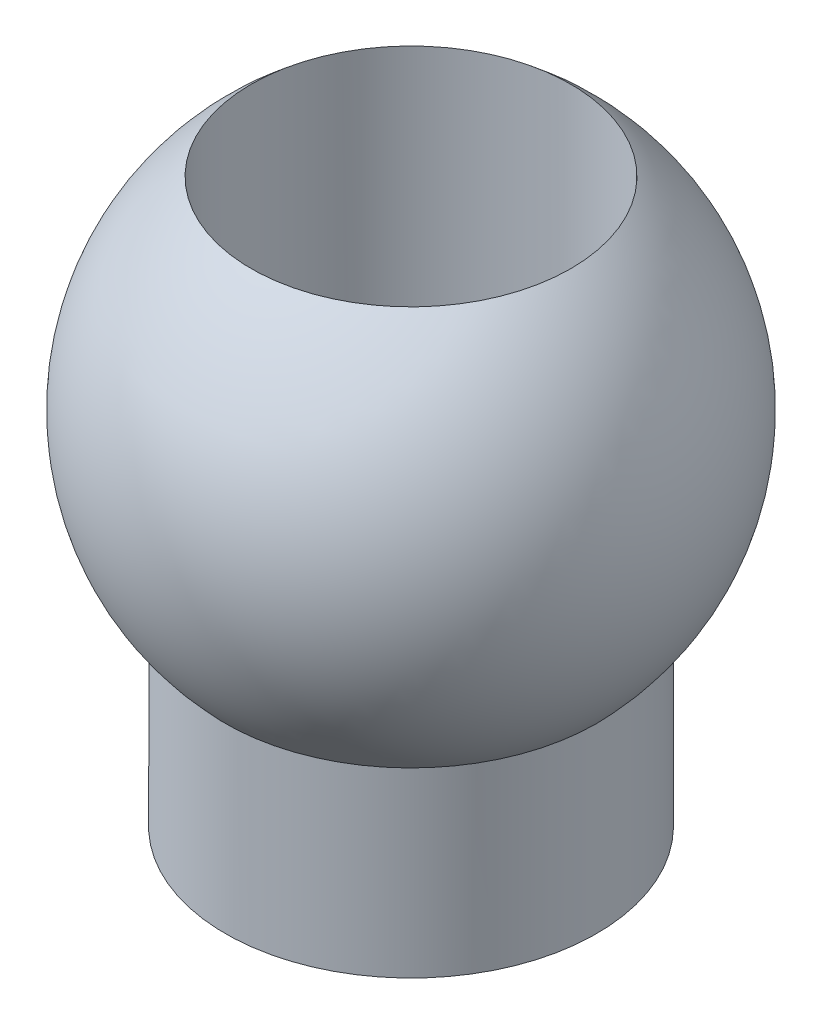
ISO-10303-21;
HEADER;
FILE_DESCRIPTION(('STEP AP214'),'2;1');
FILE_NAME('part.step','',(''),(''),'','','');
FILE_SCHEMA(('AUTOMOTIVE_DESIGN { 1 0 10303 214 1 1 1 1 }'));
ENDSEC;
DATA;
#1=APPLICATION_CONTEXT('core data for automotive mechanical design processes');
#2=APPLICATION_PROTOCOL_DEFINITION('international standard','automotive_design',2000,#1);
#3=PRODUCT_CONTEXT('',#1,'mechanical');
#4=PRODUCT('Part','Part','',(#3));
#5=PRODUCT_RELATED_PRODUCT_CATEGORY('part','',(#4));
#6=PRODUCT_DEFINITION_FORMATION('','',#4);
#7=PRODUCT_DEFINITION_CONTEXT('part definition',#1,'design');
#8=PRODUCT_DEFINITION('design','',#6,#7);
#9=PRODUCT_DEFINITION_SHAPE('','',#8);
#10=(LENGTH_UNIT() NAMED_UNIT(*) SI_UNIT(.MILLI.,.METRE.));
#11=(NAMED_UNIT(*) PLANE_ANGLE_UNIT() SI_UNIT($,.RADIAN.));
#12=(NAMED_UNIT(*) SI_UNIT($,.STERADIAN.) SOLID_ANGLE_UNIT());
#13=UNCERTAINTY_MEASURE_WITH_UNIT(LENGTH_MEASURE(1.E-05),#10,'distance_accuracy_value','');
#14=(GEOMETRIC_REPRESENTATION_CONTEXT(3) GLOBAL_UNCERTAINTY_ASSIGNED_CONTEXT((#13)) GLOBAL_UNIT_ASSIGNED_CONTEXT((#10,
#11,#12)) REPRESENTATION_CONTEXT('',''));
#15=CARTESIAN_POINT('',(0.,0.,0.));
#16=DIRECTION('',(0.,0.,1.));
#17=DIRECTION('',(1.,0.,0.));
#18=AXIS2_PLACEMENT_3D('',#15,#16,#17);
#19=CARTESIAN_POINT('',(0.,0.,0.));
#20=DIRECTION('',(0.,-1.,0.));
#21=DIRECTION('',(0.,0.,-1.));
#22=AXIS2_PLACEMENT_3D('',#19,#20,#21);
#23=PLANE('',#22);
#24=CARTESIAN_POINT('',(0.,0.,0.));
#25=DIRECTION('',(0.,-1.,0.));
#26=DIRECTION('',(0.,0.,-1.));
#27=AXIS2_PLACEMENT_3D('',#24,#25,#26);
#28=CIRCLE('',#27,1.55);
#29=CARTESIAN_POINT('',(0.,0.,-1.55));
#30=VERTEX_POINT('',#29);
#31=EDGE_CURVE('E48',#30,#30,#28,.T.);
#32=ORIENTED_EDGE('',*,*,#31,.F.);
#33=EDGE_LOOP('',(#32));
#34=FACE_BOUND('',#33,.T.);
#35=CARTESIAN_POINT('',(0.,0.,0.));
#36=DIRECTION('',(0.,-1.,0.));
#37=DIRECTION('',(0.,0.,-1.));
#38=AXIS2_PLACEMENT_3D('',#35,#36,#37);
#39=CIRCLE('',#38,1.8);
#40=CARTESIAN_POINT('',(0.,0.,-1.8));
#41=VERTEX_POINT('',#40);
#42=EDGE_CURVE('E44',#41,#41,#39,.T.);
#43=ORIENTED_EDGE('',*,*,#42,.T.);
#44=EDGE_LOOP('',(#43));
#45=FACE_BOUND('',#44,.T.);
#46=ADVANCED_FACE('F37',(#34,#45),#23,.T.);
#47=CARTESIAN_POINT('',(0.,3.5,0.));
#48=DIRECTION('',(0.,-1.,0.));
#49=DIRECTION('',(1.,0.,0.));
#50=AXIS2_PLACEMENT_3D('',#47,#48,#49);
#51=SPHERICAL_SURFACE('',#50,2.5);
#52=CARTESIAN_POINT('',(0.,5.4615045245933,0.));
#53=DIRECTION('',(0.,-1.,0.));
#54=DIRECTION('',(0.,0.,-1.));
#55=AXIS2_PLACEMENT_3D('',#52,#53,#54);
#56=CIRCLE('',#55,1.55);
#57=CARTESIAN_POINT('',(1.55,5.4615045245933,0.));
#58=VERTEX_POINT('',#57);
#59=EDGE_CURVE('E40',#58,#58,#56,.F.);
#60=CARTESIAN_POINT('',(0.,1.76506484271025,0.));
#61=DIRECTION('',(0.,-1.,0.));
#62=DIRECTION('',(0.,0.,-1.));
#63=AXIS2_PLACEMENT_3D('',#60,#61,#62);
#64=CIRCLE('',#63,1.8);
#65=CARTESIAN_POINT('',(1.8,1.76506484271025,0.));
#66=VERTEX_POINT('',#65);
#67=EDGE_CURVE('E10',#66,#66,#64,.T.);
#68=CARTESIAN_POINT('',(1.55,5.4615045245933,0.));
#69=CARTESIAN_POINT('',(1.58410327621643,5.43455719270086,0.));
#70=CARTESIAN_POINT('',(1.6175023493976,5.40671886245339,0.));
#71=CARTESIAN_POINT('',(1.68280445952651,5.34933957252458,0.));
#72=CARTESIAN_POINT('',(1.71470749647424,5.31979861284324,0.));
#73=CARTESIAN_POINT('',(1.77692990397332,5.25909343132291,0.));
#74=CARTESIAN_POINT('',(1.80724927452467,5.22792920948392,0.));
#75=CARTESIAN_POINT('',(1.86622211661338,5.16406252672216,0.));
#76=CARTESIAN_POINT('',(1.89487558815074,5.1313600657994,0.));
#77=CARTESIAN_POINT('',(1.95043863839102,5.06450577918777,0.));
#78=CARTESIAN_POINT('',(1.97734821709394,5.03035395349891,0.));
#79=CARTESIAN_POINT('',(2.0293503091851,4.96069384276134,0.));
#80=CARTESIAN_POINT('',(2.05444282257334,4.92518555771264,0.));
#81=CARTESIAN_POINT('',(2.1027425326583,4.85290909910658,0.));
#82=CARTESIAN_POINT('',(2.12594972935503,4.81614092554922,0.));
#83=CARTESIAN_POINT('',(2.17041568800909,4.74144469383435,0.));
#84=CARTESIAN_POINT('',(2.19167444996643,4.70351663567685,0.));
#85=CARTESIAN_POINT('',(2.23218571896611,4.6266037916256,0.));
#86=CARTESIAN_POINT('',(2.25143822600846,4.58761900573185,0.));
#87=CARTESIAN_POINT('',(2.28788462204426,4.50869873763307,0.));
#88=CARTESIAN_POINT('',(2.30507851103772,4.46876325542805,0.));
#89=CARTESIAN_POINT('',(2.33736090678991,4.38805021172483,0.));
#90=CARTESIAN_POINT('',(2.35244941354863,4.34727265022664,0.));
#91=CARTESIAN_POINT('',(2.38048000692047,4.26498635528641,0.));
#92=CARTESIAN_POINT('',(2.39342209353359,4.22347762184437,0.));
#93=CARTESIAN_POINT('',(2.41712464655699,4.13984187900786,0.));
#94=CARTESIAN_POINT('',(2.42788511296728,4.0977148696134,0.));
#95=CARTESIAN_POINT('',(2.44719515912892,4.01295715246084,0.));
#96=CARTESIAN_POINT('',(2.45574473888028,3.97032644470274,0.));
#97=CARTESIAN_POINT('',(2.47060975846568,3.88467727837642,0.));
#98=CARTESIAN_POINT('',(2.47692519829974,3.8416588198082,0.));
#99=CARTESIAN_POINT('',(2.48730476123514,3.75535115402502,0.));
#100=CARTESIAN_POINT('',(2.49136888433649,3.71206194681006,0.));
#101=CARTESIAN_POINT('',(2.49723476015158,3.62533052228244,0.));
#102=CARTESIAN_POINT('',(2.49903651286533,3.58188830496977,0.));
#103=CARTESIAN_POINT('',(2.50037274747474,3.49496901495461,0.));
#104=CARTESIAN_POINT('',(2.49990722937042,3.45149194225212,0.));
#105=CARTESIAN_POINT('',(2.49671018846586,3.36462119096538,0.));
#106=CARTESIAN_POINT('',(2.49397866566563,3.32122751238113,0.));
#107=CARTESIAN_POINT('',(2.48625704460065,3.23464157202239,0.));
#108=CARTESIAN_POINT('',(2.48126694633589,3.1914493102479,0.));
#109=CARTESIAN_POINT('',(2.46904174647556,3.10538367838467,0.));
#110=CARTESIAN_POINT('',(2.46180664487997,3.06251030829594,0.));
#111=CARTESIAN_POINT('',(2.4451111164833,2.97719906735241,0.));
#112=CARTESIAN_POINT('',(2.43565068968222,2.93476119649762,0.));
#113=CARTESIAN_POINT('',(2.41453024145945,2.85043637710139,0.));
#114=CARTESIAN_POINT('',(2.40287022003777,2.80854942855995,0.));
#115=CARTESIAN_POINT('',(2.37738229567794,2.72544037843538,0.));
#116=CARTESIAN_POINT('',(2.36355439273978,2.68421827685225,0.));
#117=CARTESIAN_POINT('',(2.33376831455976,2.60255103713723,0.));
#118=CARTESIAN_POINT('',(2.3178101393179,2.56210589900533,0.));
#119=CARTESIAN_POINT('',(2.28380692014723,2.4821025890897,0.));
#120=CARTESIAN_POINT('',(2.26576187621842,2.44254441730595,0.));
#121=CARTESIAN_POINT('',(2.22763399746029,2.36442263209638,0.));
#122=CARTESIAN_POINT('',(2.20755116263096,2.32585901867056,0.));
#123=CARTESIAN_POINT('',(2.16540232869856,2.24983123159263,0.));
#124=CARTESIAN_POINT('',(2.14333632959548,2.21236705794054,0.));
#125=CARTESIAN_POINT('',(2.0972811635807,2.1386400623846,0.));
#126=CARTESIAN_POINT('',(2.07329199666899,2.10237724048077,0.));
#127=CARTESIAN_POINT('',(2.02345581171938,2.03115151520767,0.));
#128=CARTESIAN_POINT('',(1.99760879368148,1.99618861183841,0.));
#129=CARTESIAN_POINT('',(1.94412694192524,1.92765804500053,0.));
#130=CARTESIAN_POINT('',(1.91649210820691,1.8940903815319,0.));
#131=CARTESIAN_POINT('',(1.85951077047679,1.82844073834545,0.));
#132=CARTESIAN_POINT('',(1.83016426646501,1.79635875862761,0.));
#133=CARTESIAN_POINT('',(1.8,1.76506484271025,0.));
#134=B_SPLINE_CURVE_WITH_KNOTS('',3,(#68,#69,#70,#71,#72,#73,#74,#75,#76,#77,#78,#79,#80,#81,
#82,#83,#84,#85,#86,#87,#88,#89,#90,#91,#92,#93,#94,#95,#96,#97,#98,#99,#100,#101,#102,#103,
#104,#105,#106,#107,#108,#109,#110,#111,#112,#113,#114,#115,#116,#117,#118,#119,#120,#121,#122,
#123,#124,#125,#126,#127,#128,#129,#130,#131,#132,#133),.UNSPECIFIED.,.F.,.F.,(4,2,2,2,2,2,2,2,
2,2,2,2,2,2,2,2,2,2,2,2,2,2,2,2,2,2,2,2,2,2,2,2,4),(0.,0.130379566349561,0.260759132699122,
0.391138699048682,0.521518265398244,0.651897831747805,0.782277398097366,0.912656964446927,
1.04303653079649,1.17341609714605,1.30379566349561,1.43417522984517,1.56455479619473,
1.69493436254429,1.82531392889385,1.95569349524341,2.08607306159298,2.21645262794254,
2.3468321942921,2.47721176064166,2.60759132699122,2.73797089334078,2.86835045969034,
2.9987300260399,3.12910959238946,3.25948915873902,3.38986872508859,3.52024829143815,
3.65062785778771,3.78100742413727,3.91138699048683,4.04176655683639,4.17214612318595),.UNSPECIFIED.);
#135=EDGE_CURVE('BSEAM59',#58,#66,#134,.T.);
#136=ORIENTED_EDGE('',*,*,#59,.F.);
#137=ORIENTED_EDGE('',*,*,#67,.F.);
#138=ORIENTED_EDGE('',*,*,#135,.T.);
#139=ORIENTED_EDGE('',*,*,#135,.F.);
#140=EDGE_LOOP('',(#136,#138,#137,#139));
#141=FACE_BOUND('',#140,.T.);
#142=ADVANCED_FACE('F59',(#141),#51,.T.);
#143=CARTESIAN_POINT('',(0.,0.,0.));
#144=DIRECTION('',(0.,-1.,0.));
#145=DIRECTION('',(0.,0.,-1.));
#146=AXIS2_PLACEMENT_3D('',#143,#144,#145);
#147=CYLINDRICAL_SURFACE('',#146,1.8);
#148=ORIENTED_EDGE('',*,*,#67,.T.);
#149=EDGE_LOOP('',(#148));
#150=FACE_BOUND('',#149,.T.);
#151=ORIENTED_EDGE('',*,*,#42,.F.);
#152=EDGE_LOOP('',(#151));
#153=FACE_BOUND('',#152,.T.);
#154=ADVANCED_FACE('F62',(#150,#153),#147,.T.);
#155=CARTESIAN_POINT('',(0.,-1.2E-05,0.));
#156=DIRECTION('',(0.,1.,0.));
#157=DIRECTION('',(0.,0.,1.));
#158=AXIS2_PLACEMENT_3D('',#155,#156,#157);
#159=CYLINDRICAL_SURFACE('',#158,1.55);
#160=ORIENTED_EDGE('',*,*,#31,.T.);
#161=EDGE_LOOP('',(#160));
#162=FACE_BOUND('',#161,.T.);
#163=ORIENTED_EDGE('',*,*,#59,.T.);
#164=EDGE_LOOP('',(#163));
#165=FACE_BOUND('',#164,.T.);
#166=ADVANCED_FACE('F57',(#162,#165),#159,.F.);
#167=CLOSED_SHELL('',(#46,#142,#154,#166));
#168=MANIFOLD_SOLID_BREP('B2',#167);
#169=ADVANCED_BREP_SHAPE_REPRESENTATION('',(#18,#168),#14);
#170=SHAPE_DEFINITION_REPRESENTATION(#9,#169);
ENDSEC;
END-ISO-10303-21;
